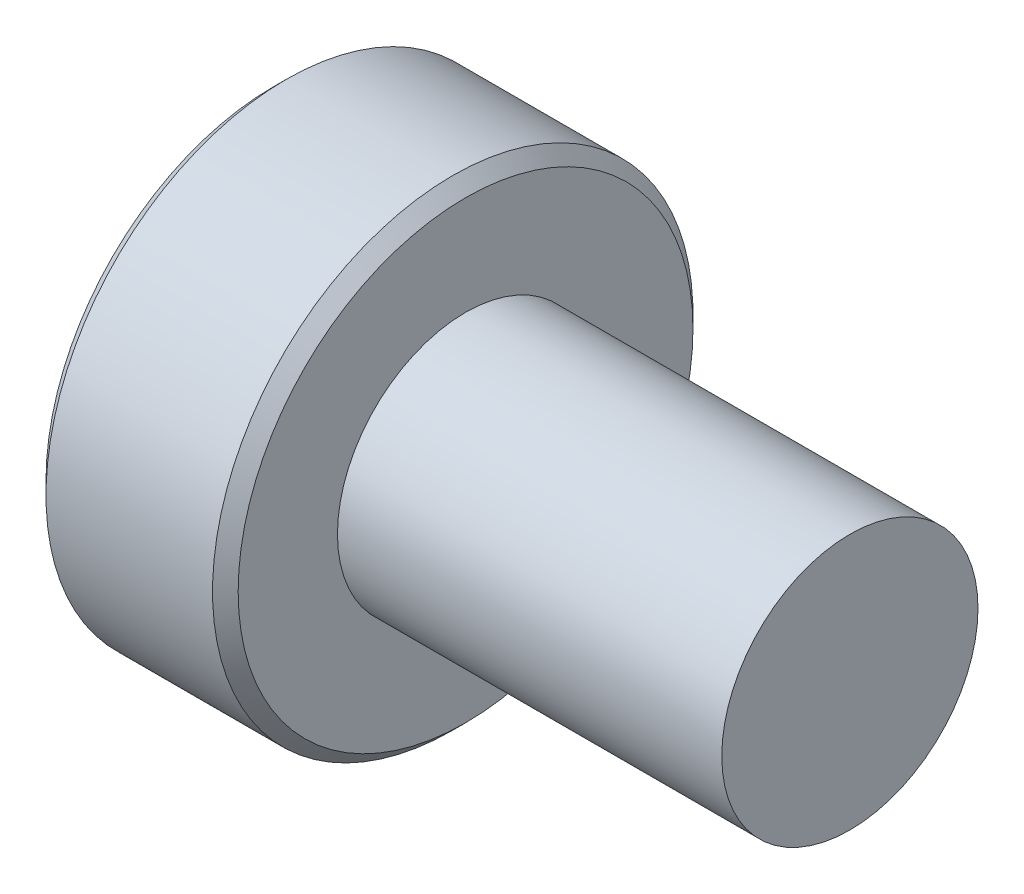
ISO-10303-21;
HEADER;
FILE_DESCRIPTION(('STEP AP214'),'2;1');
FILE_NAME('part.step','',(''),(''),'','','');
FILE_SCHEMA(('AUTOMOTIVE_DESIGN { 1 0 10303 214 1 1 1 1 }'));
ENDSEC;
DATA;
#1=APPLICATION_CONTEXT('core data for automotive mechanical design processes');
#2=APPLICATION_PROTOCOL_DEFINITION('international standard','automotive_design',2000,#1);
#3=PRODUCT_CONTEXT('',#1,'mechanical');
#4=PRODUCT('Part','Part','',(#3));
#5=PRODUCT_RELATED_PRODUCT_CATEGORY('part','',(#4));
#6=PRODUCT_DEFINITION_FORMATION('','',#4);
#7=PRODUCT_DEFINITION_CONTEXT('part definition',#1,'design');
#8=PRODUCT_DEFINITION('design','',#6,#7);
#9=PRODUCT_DEFINITION_SHAPE('','',#8);
#10=(LENGTH_UNIT() NAMED_UNIT(*) SI_UNIT(.MILLI.,.METRE.));
#11=(NAMED_UNIT(*) PLANE_ANGLE_UNIT() SI_UNIT($,.RADIAN.));
#12=(NAMED_UNIT(*) SI_UNIT($,.STERADIAN.) SOLID_ANGLE_UNIT());
#13=UNCERTAINTY_MEASURE_WITH_UNIT(LENGTH_MEASURE(1.E-05),#10,'distance_accuracy_value','');
#14=(GEOMETRIC_REPRESENTATION_CONTEXT(3) GLOBAL_UNCERTAINTY_ASSIGNED_CONTEXT((#13)) GLOBAL_UNIT_ASSIGNED_CONTEXT((#10,
#11,#12)) REPRESENTATION_CONTEXT('',''));
#15=CARTESIAN_POINT('',(0.,0.,0.));
#16=DIRECTION('',(0.,0.,1.));
#17=DIRECTION('',(1.,0.,0.));
#18=AXIS2_PLACEMENT_3D('',#15,#16,#17);
#19=CARTESIAN_POINT('',(0.,0.,0.));
#20=DIRECTION('',(1.,0.,0.));
#21=DIRECTION('',(0.,1.,0.));
#22=AXIS2_PLACEMENT_3D('',#19,#20,#21);
#23=PLANE('',#22);
#24=CARTESIAN_POINT('',(0.,0.,0.));
#25=DIRECTION('',(1.,0.,0.));
#26=DIRECTION('',(0.,1.,0.));
#27=AXIS2_PLACEMENT_3D('',#24,#25,#26);
#28=CIRCLE('',#27,3.55);
#29=CARTESIAN_POINT('',(0.,3.55,0.));
#30=VERTEX_POINT('',#29);
#31=EDGE_CURVE('E47',#30,#30,#28,.F.);
#32=ORIENTED_EDGE('',*,*,#31,.T.);
#33=EDGE_LOOP('',(#32));
#34=FACE_BOUND('',#33,.T.);
#35=ADVANCED_FACE('F32',(#34),#23,.F.);
#36=CARTESIAN_POINT('',(9.,0.,0.));
#37=DIRECTION('',(-1.,0.,0.));
#38=DIRECTION('',(0.,-1.,0.));
#39=AXIS2_PLACEMENT_3D('',#36,#37,#38);
#40=CYLINDRICAL_SURFACE('',#39,3.75);
#41=CARTESIAN_POINT('',(0.199999999999999,0.,0.));
#42=DIRECTION('',(1.,0.,0.));
#43=DIRECTION('',(0.,1.,0.));
#44=AXIS2_PLACEMENT_3D('',#41,#42,#43);
#45=CIRCLE('',#44,3.75);
#46=CARTESIAN_POINT('',(0.199999999999999,3.75,0.));
#47=VERTEX_POINT('',#46);
#48=EDGE_CURVE('E39',#47,#47,#45,.T.);
#49=ORIENTED_EDGE('',*,*,#48,.T.);
#50=EDGE_LOOP('',(#49));
#51=FACE_BOUND('',#50,.T.);
#52=CARTESIAN_POINT('',(2.8,0.,0.));
#53=DIRECTION('',(-1.,0.,0.));
#54=DIRECTION('',(0.,-1.,0.));
#55=AXIS2_PLACEMENT_3D('',#52,#53,#54);
#56=CIRCLE('',#55,3.75);
#57=CARTESIAN_POINT('',(2.8,-3.75,0.));
#58=VERTEX_POINT('',#57);
#59=EDGE_CURVE('E43',#58,#58,#56,.T.);
#60=ORIENTED_EDGE('',*,*,#59,.T.);
#61=EDGE_LOOP('',(#60));
#62=FACE_BOUND('',#61,.T.);
#63=ADVANCED_FACE('F74',(#51,#62),#40,.T.);
#64=CARTESIAN_POINT('',(3.,3.75,0.));
#65=DIRECTION('',(-1.,0.,0.));
#66=DIRECTION('',(0.,-1.,0.));
#67=AXIS2_PLACEMENT_3D('',#64,#65,#66);
#68=PLANE('',#67);
#69=CARTESIAN_POINT('',(3.,0.,0.));
#70=DIRECTION('',(-1.,0.,0.));
#71=DIRECTION('',(0.,-1.,0.));
#72=AXIS2_PLACEMENT_3D('',#69,#70,#71);
#73=CIRCLE('',#72,3.55);
#74=CARTESIAN_POINT('',(3.,-3.55,0.));
#75=VERTEX_POINT('',#74);
#76=EDGE_CURVE('E10',#75,#75,#73,.F.);
#77=ORIENTED_EDGE('',*,*,#76,.T.);
#78=EDGE_LOOP('',(#77));
#79=FACE_BOUND('',#78,.T.);
#80=CARTESIAN_POINT('',(3.,0.,0.));
#81=DIRECTION('',(-1.,0.,0.));
#82=DIRECTION('',(0.,-1.,0.));
#83=AXIS2_PLACEMENT_3D('',#80,#81,#82);
#84=CIRCLE('',#83,2.);
#85=CARTESIAN_POINT('',(3.,-2.,0.));
#86=VERTEX_POINT('',#85);
#87=EDGE_CURVE('E52',#86,#86,#84,.T.);
#88=ORIENTED_EDGE('',*,*,#87,.T.);
#89=EDGE_LOOP('',(#88));
#90=FACE_BOUND('',#89,.T.);
#91=ADVANCED_FACE('F70',(#79,#90),#68,.F.);
#92=CARTESIAN_POINT('',(9.,0.,0.));
#93=DIRECTION('',(-1.,0.,0.));
#94=DIRECTION('',(0.,-1.,0.));
#95=AXIS2_PLACEMENT_3D('',#92,#93,#94);
#96=CYLINDRICAL_SURFACE('',#95,2.);
#97=ORIENTED_EDGE('',*,*,#87,.F.);
#98=EDGE_LOOP('',(#97));
#99=FACE_BOUND('',#98,.T.);
#100=CARTESIAN_POINT('',(9.,0.,0.));
#101=DIRECTION('',(-1.,0.,0.));
#102=DIRECTION('',(0.,-1.,0.));
#103=AXIS2_PLACEMENT_3D('',#100,#101,#102);
#104=CIRCLE('',#103,2.);
#105=CARTESIAN_POINT('',(9.,-2.,0.));
#106=VERTEX_POINT('',#105);
#107=EDGE_CURVE('E55',#106,#106,#104,.T.);
#108=ORIENTED_EDGE('',*,*,#107,.T.);
#109=EDGE_LOOP('',(#108));
#110=FACE_BOUND('',#109,.T.);
#111=ADVANCED_FACE('F59',(#99,#110),#96,.T.);
#112=CARTESIAN_POINT('',(9.,2.,0.));
#113=DIRECTION('',(-1.,0.,0.));
#114=DIRECTION('',(0.,-1.,0.));
#115=AXIS2_PLACEMENT_3D('',#112,#113,#114);
#116=PLANE('',#115);
#117=ORIENTED_EDGE('',*,*,#107,.F.);
#118=EDGE_LOOP('',(#117));
#119=FACE_BOUND('',#118,.T.);
#120=ADVANCED_FACE('F61',(#119),#116,.F.);
#121=CARTESIAN_POINT('',(0.,0.,0.));
#122=DIRECTION('',(1.,0.,0.));
#123=DIRECTION('',(0.,1.,0.));
#124=AXIS2_PLACEMENT_3D('',#121,#122,#123);
#125=CONICAL_SURFACE('',#124,3.55,0.785398163397446);
#126=ORIENTED_EDGE('',*,*,#48,.F.);
#127=EDGE_LOOP('',(#126));
#128=FACE_BOUND('',#127,.T.);
#129=ORIENTED_EDGE('',*,*,#31,.F.);
#130=EDGE_LOOP('',(#129));
#131=FACE_BOUND('',#130,.T.);
#132=ADVANCED_FACE('F63',(#128,#131),#125,.T.);
#133=CARTESIAN_POINT('',(2.8,0.,0.));
#134=DIRECTION('',(-1.,0.,0.));
#135=DIRECTION('',(0.,-1.,0.));
#136=AXIS2_PLACEMENT_3D('',#133,#134,#135);
#137=CONICAL_SURFACE('',#136,3.75,0.785398163397453);
#138=CARTESIAN_POINT('',(3.,-3.55,0.));
#139=CARTESIAN_POINT('',(2.99791666666667,-3.55208333333333,0.));
#140=CARTESIAN_POINT('',(2.99583333333333,-3.55416666666666,0.));
#141=CARTESIAN_POINT('',(2.99166666666667,-3.55833333333333,0.));
#142=CARTESIAN_POINT('',(2.98958333333333,-3.56041666666666,0.));
#143=CARTESIAN_POINT('',(2.98541666666667,-3.56458333333333,0.));
#144=CARTESIAN_POINT('',(2.98333333333333,-3.56666666666667,0.));
#145=CARTESIAN_POINT('',(2.97916666666667,-3.57083333333333,0.));
#146=CARTESIAN_POINT('',(2.97708333333333,-3.57291666666666,0.));
#147=CARTESIAN_POINT('',(2.97291666666667,-3.57708333333333,0.));
#148=CARTESIAN_POINT('',(2.97083333333333,-3.57916666666666,0.));
#149=CARTESIAN_POINT('',(2.96666666666667,-3.58333333333333,0.));
#150=CARTESIAN_POINT('',(2.96458333333333,-3.58541666666666,0.));
#151=CARTESIAN_POINT('',(2.96041666666667,-3.58958333333333,0.));
#152=CARTESIAN_POINT('',(2.95833333333333,-3.59166666666666,0.));
#153=CARTESIAN_POINT('',(2.95416666666667,-3.59583333333333,0.));
#154=CARTESIAN_POINT('',(2.95208333333333,-3.59791666666666,0.));
#155=CARTESIAN_POINT('',(2.94791666666667,-3.60208333333333,0.));
#156=CARTESIAN_POINT('',(2.94583333333333,-3.60416666666666,0.));
#157=CARTESIAN_POINT('',(2.94166666666667,-3.60833333333333,0.));
#158=CARTESIAN_POINT('',(2.93958333333333,-3.61041666666666,0.));
#159=CARTESIAN_POINT('',(2.93541666666667,-3.61458333333333,0.));
#160=CARTESIAN_POINT('',(2.93333333333333,-3.61666666666666,0.));
#161=CARTESIAN_POINT('',(2.92916666666667,-3.62083333333333,0.));
#162=CARTESIAN_POINT('',(2.92708333333333,-3.62291666666667,0.));
#163=CARTESIAN_POINT('',(2.92291666666667,-3.62708333333333,0.));
#164=CARTESIAN_POINT('',(2.92083333333333,-3.62916666666667,0.));
#165=CARTESIAN_POINT('',(2.91666666666667,-3.63333333333333,0.));
#166=CARTESIAN_POINT('',(2.91458333333333,-3.63541666666666,0.));
#167=CARTESIAN_POINT('',(2.91041666666667,-3.63958333333333,0.));
#168=CARTESIAN_POINT('',(2.90833333333333,-3.64166666666667,0.));
#169=CARTESIAN_POINT('',(2.90416666666667,-3.64583333333333,0.));
#170=CARTESIAN_POINT('',(2.90208333333333,-3.64791666666666,0.));
#171=CARTESIAN_POINT('',(2.89791666666667,-3.65208333333333,0.));
#172=CARTESIAN_POINT('',(2.89583333333333,-3.65416666666667,0.));
#173=CARTESIAN_POINT('',(2.89166666666667,-3.65833333333333,0.));
#174=CARTESIAN_POINT('',(2.88958333333333,-3.66041666666667,0.));
#175=CARTESIAN_POINT('',(2.88541666666667,-3.66458333333333,0.));
#176=CARTESIAN_POINT('',(2.88333333333333,-3.66666666666667,0.));
#177=CARTESIAN_POINT('',(2.87916666666667,-3.67083333333333,0.));
#178=CARTESIAN_POINT('',(2.87708333333333,-3.67291666666667,0.));
#179=CARTESIAN_POINT('',(2.87291666666667,-3.67708333333333,0.));
#180=CARTESIAN_POINT('',(2.87083333333333,-3.67916666666667,0.));
#181=CARTESIAN_POINT('',(2.86666666666667,-3.68333333333333,0.));
#182=CARTESIAN_POINT('',(2.86458333333333,-3.68541666666667,0.));
#183=CARTESIAN_POINT('',(2.86041666666667,-3.68958333333333,0.));
#184=CARTESIAN_POINT('',(2.85833333333333,-3.69166666666667,0.));
#185=CARTESIAN_POINT('',(2.85416666666667,-3.69583333333333,0.));
#186=CARTESIAN_POINT('',(2.85208333333333,-3.69791666666667,0.));
#187=CARTESIAN_POINT('',(2.84791666666667,-3.70208333333333,0.));
#188=CARTESIAN_POINT('',(2.84583333333333,-3.70416666666667,0.));
#189=CARTESIAN_POINT('',(2.84166666666667,-3.70833333333333,0.));
#190=CARTESIAN_POINT('',(2.83958333333333,-3.71041666666667,0.));
#191=CARTESIAN_POINT('',(2.83541666666667,-3.71458333333333,0.));
#192=CARTESIAN_POINT('',(2.83333333333333,-3.71666666666667,0.));
#193=CARTESIAN_POINT('',(2.82916666666667,-3.72083333333333,0.));
#194=CARTESIAN_POINT('',(2.82708333333333,-3.72291666666667,0.));
#195=CARTESIAN_POINT('',(2.82291666666667,-3.72708333333333,0.));
#196=CARTESIAN_POINT('',(2.82083333333333,-3.72916666666667,0.));
#197=CARTESIAN_POINT('',(2.81666666666667,-3.73333333333333,0.));
#198=CARTESIAN_POINT('',(2.81458333333333,-3.73541666666667,0.));
#199=CARTESIAN_POINT('',(2.81041666666667,-3.73958333333333,0.));
#200=CARTESIAN_POINT('',(2.80833333333333,-3.74166666666667,0.));
#201=CARTESIAN_POINT('',(2.80416666666667,-3.74583333333333,0.));
#202=CARTESIAN_POINT('',(2.80208333333333,-3.74791666666667,0.));
#203=CARTESIAN_POINT('',(2.8,-3.75,0.));
#204=B_SPLINE_CURVE_WITH_KNOTS('',3,(#138,#139,#140,#141,#142,#143,#144,#145,#146,#147,#148,
#149,#150,#151,#152,#153,#154,#155,#156,#157,#158,#159,#160,#161,#162,#163,#164,#165,#166,#167,
#168,#169,#170,#171,#172,#173,#174,#175,#176,#177,#178,#179,#180,#181,#182,#183,#184,#185,#186,
#187,#188,#189,#190,#191,#192,#193,#194,#195,#196,#197,#198,#199,#200,#201,#202,#203),
.UNSPECIFIED.,.F.,.F.,(4,2,2,2,2,2,2,2,2,2,2,2,2,2,2,2,2,2,2,2,2,2,2,2,2,2,2,2,2,2,2,2,4),(0.,
0.00883883476483179,0.0176776695296639,0.0265165042944957,0.0353553390593275,0.0441941738241593,
0.0530330085889914,0.0618718433538231,0.0707106781186549,0.079549512883487,0.0883883476483185,
0.0972271824131506,0.106066017177982,0.114904851942814,0.123743686707646,0.132582521472478,
0.14142135623731,0.150260191002142,0.159099025766974,0.167937860531806,0.176776695296637,
0.185615530061469,0.194454364826301,0.203293199591133,0.212132034355965,0.220970869120797,
0.229809703885628,0.238648538650461,0.247487373415292,0.256326208180124,0.265165042944956,
0.274003877709788,0.28284271247462),.UNSPECIFIED.);
#205=EDGE_CURVE('BSEAM34',#75,#58,#204,.T.);
#206=ORIENTED_EDGE('',*,*,#76,.F.);
#207=ORIENTED_EDGE('',*,*,#59,.F.);
#208=ORIENTED_EDGE('',*,*,#205,.T.);
#209=ORIENTED_EDGE('',*,*,#205,.F.);
#210=EDGE_LOOP('',(#206,#208,#207,#209));
#211=FACE_BOUND('',#210,.T.);
#212=ADVANCED_FACE('F34',(#211),#137,.T.);
#213=CLOSED_SHELL('',(#35,#63,#91,#111,#120,#132,#212));
#214=MANIFOLD_SOLID_BREP('B2',#213);
#215=ADVANCED_BREP_SHAPE_REPRESENTATION('',(#18,#214),#14);
#216=SHAPE_DEFINITION_REPRESENTATION(#9,#215);
ENDSEC;
END-ISO-10303-21;
